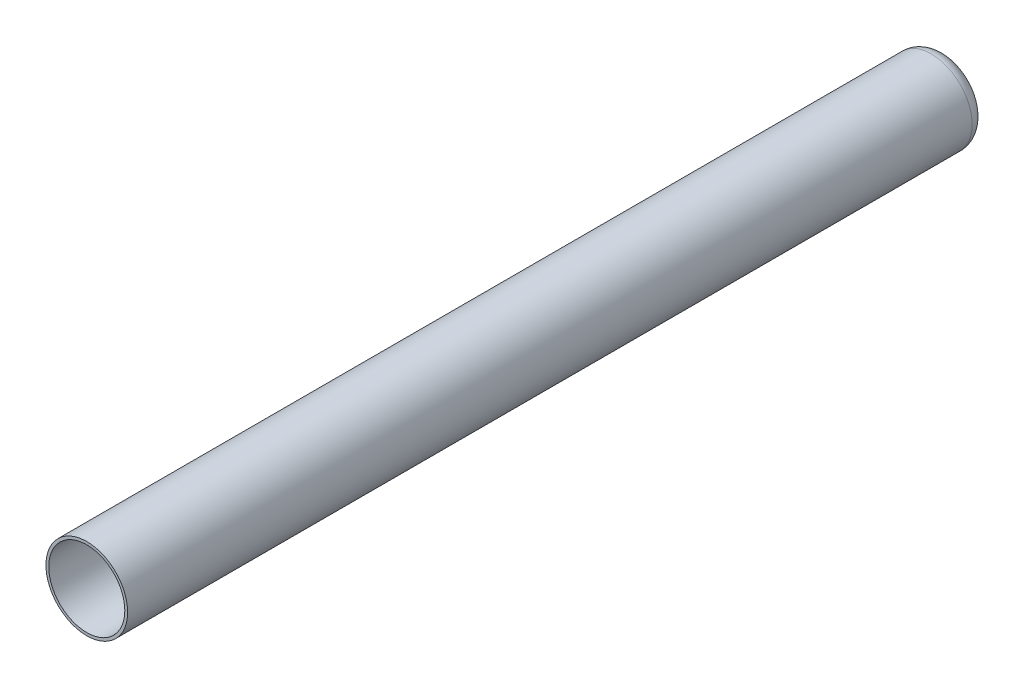
ISO-10303-21;
HEADER;
FILE_DESCRIPTION(('STEP AP214'),'2;1');
FILE_NAME('part.step','',(''),(''),'','','');
FILE_SCHEMA(('AUTOMOTIVE_DESIGN { 1 0 10303 214 1 1 1 1 }'));
ENDSEC;
DATA;
#1=APPLICATION_CONTEXT('core data for automotive mechanical design processes');
#2=APPLICATION_PROTOCOL_DEFINITION('international standard','automotive_design',2000,#1);
#3=PRODUCT_CONTEXT('',#1,'mechanical');
#4=PRODUCT('Part','Part','',(#3));
#5=PRODUCT_RELATED_PRODUCT_CATEGORY('part','',(#4));
#6=PRODUCT_DEFINITION_FORMATION('','',#4);
#7=PRODUCT_DEFINITION_CONTEXT('part definition',#1,'design');
#8=PRODUCT_DEFINITION('design','',#6,#7);
#9=PRODUCT_DEFINITION_SHAPE('','',#8);
#10=(LENGTH_UNIT() NAMED_UNIT(*) SI_UNIT(.MILLI.,.METRE.));
#11=(NAMED_UNIT(*) PLANE_ANGLE_UNIT() SI_UNIT($,.RADIAN.));
#12=(NAMED_UNIT(*) SI_UNIT($,.STERADIAN.) SOLID_ANGLE_UNIT());
#13=UNCERTAINTY_MEASURE_WITH_UNIT(LENGTH_MEASURE(1.E-05),#10,'distance_accuracy_value','');
#14=(GEOMETRIC_REPRESENTATION_CONTEXT(3) GLOBAL_UNCERTAINTY_ASSIGNED_CONTEXT((#13)) GLOBAL_UNIT_ASSIGNED_CONTEXT((#10,
#11,#12)) REPRESENTATION_CONTEXT('',''));
#15=CARTESIAN_POINT('',(0.,0.,0.));
#16=DIRECTION('',(0.,0.,1.));
#17=DIRECTION('',(1.,0.,0.));
#18=AXIS2_PLACEMENT_3D('',#15,#16,#17);
#19=CARTESIAN_POINT('',(0.,0.,-304.8));
#20=DIRECTION('',(0.,0.,1.));
#21=DIRECTION('',(1.,0.,0.));
#22=AXIS2_PLACEMENT_3D('',#19,#20,#21);
#23=CYLINDRICAL_SURFACE('',#22,14.5);
#24=CARTESIAN_POINT('',(0.,0.,-299.8));
#25=DIRECTION('',(0.,0.,1.));
#26=DIRECTION('',(1.,0.,0.));
#27=AXIS2_PLACEMENT_3D('',#24,#25,#26);
#28=CIRCLE('',#27,14.5);
#29=CARTESIAN_POINT('',(14.5,0.,-299.8));
#30=VERTEX_POINT('',#29);
#31=EDGE_CURVE('E11',#30,#30,#28,.T.);
#32=CARTESIAN_POINT('',(0.,0.,0.));
#33=DIRECTION('',(0.,0.,1.));
#34=DIRECTION('',(1.,0.,0.));
#35=AXIS2_PLACEMENT_3D('',#32,#33,#34);
#36=CIRCLE('',#35,14.5);
#37=CARTESIAN_POINT('',(14.5,0.,0.));
#38=VERTEX_POINT('',#37);
#39=EDGE_CURVE('E42',#38,#38,#36,.T.);
#40=CARTESIAN_POINT('',(14.5,0.,-299.8));
#41=CARTESIAN_POINT('',(14.5,0.,-296.677083333333));
#42=CARTESIAN_POINT('',(14.5,0.,-293.554166666667));
#43=CARTESIAN_POINT('',(14.5,0.,-287.308333333333));
#44=CARTESIAN_POINT('',(14.5,0.,-284.185416666667));
#45=CARTESIAN_POINT('',(14.5,0.,-277.939583333333));
#46=CARTESIAN_POINT('',(14.5,0.,-274.816666666667));
#47=CARTESIAN_POINT('',(14.5,0.,-268.570833333333));
#48=CARTESIAN_POINT('',(14.5,0.,-265.447916666667));
#49=CARTESIAN_POINT('',(14.5,0.,-259.202083333333));
#50=CARTESIAN_POINT('',(14.5,0.,-256.079166666667));
#51=CARTESIAN_POINT('',(14.5,0.,-249.833333333333));
#52=CARTESIAN_POINT('',(14.5,0.,-246.710416666667));
#53=CARTESIAN_POINT('',(14.5,0.,-240.464583333333));
#54=CARTESIAN_POINT('',(14.5,0.,-237.341666666667));
#55=CARTESIAN_POINT('',(14.5,0.,-231.095833333333));
#56=CARTESIAN_POINT('',(14.5,0.,-227.972916666667));
#57=CARTESIAN_POINT('',(14.5,0.,-221.727083333333));
#58=CARTESIAN_POINT('',(14.5,0.,-218.604166666667));
#59=CARTESIAN_POINT('',(14.5,0.,-212.358333333333));
#60=CARTESIAN_POINT('',(14.5,0.,-209.235416666667));
#61=CARTESIAN_POINT('',(14.5,0.,-202.989583333333));
#62=CARTESIAN_POINT('',(14.5,0.,-199.866666666667));
#63=CARTESIAN_POINT('',(14.5,0.,-193.620833333333));
#64=CARTESIAN_POINT('',(14.5,0.,-190.497916666667));
#65=CARTESIAN_POINT('',(14.5,0.,-184.252083333333));
#66=CARTESIAN_POINT('',(14.5,0.,-181.129166666667));
#67=CARTESIAN_POINT('',(14.5,0.,-174.883333333333));
#68=CARTESIAN_POINT('',(14.5,0.,-171.760416666667));
#69=CARTESIAN_POINT('',(14.5,0.,-165.514583333333));
#70=CARTESIAN_POINT('',(14.5,0.,-162.391666666667));
#71=CARTESIAN_POINT('',(14.5,0.,-156.145833333333));
#72=CARTESIAN_POINT('',(14.5,0.,-153.022916666667));
#73=CARTESIAN_POINT('',(14.5,0.,-146.777083333333));
#74=CARTESIAN_POINT('',(14.5,0.,-143.654166666667));
#75=CARTESIAN_POINT('',(14.5,0.,-137.408333333333));
#76=CARTESIAN_POINT('',(14.5,0.,-134.285416666667));
#77=CARTESIAN_POINT('',(14.5,0.,-128.039583333333));
#78=CARTESIAN_POINT('',(14.5,0.,-124.916666666667));
#79=CARTESIAN_POINT('',(14.5,0.,-118.670833333333));
#80=CARTESIAN_POINT('',(14.5,0.,-115.547916666667));
#81=CARTESIAN_POINT('',(14.5,0.,-109.302083333333));
#82=CARTESIAN_POINT('',(14.5,0.,-106.179166666667));
#83=CARTESIAN_POINT('',(14.5,0.,-99.9333333333334));
#84=CARTESIAN_POINT('',(14.5,0.,-96.8104166666667));
#85=CARTESIAN_POINT('',(14.5,0.,-90.5645833333334));
#86=CARTESIAN_POINT('',(14.5,0.,-87.4416666666667));
#87=CARTESIAN_POINT('',(14.5,0.,-81.1958333333334));
#88=CARTESIAN_POINT('',(14.5,0.,-78.0729166666667));
#89=CARTESIAN_POINT('',(14.5,0.,-71.8270833333333));
#90=CARTESIAN_POINT('',(14.5,0.,-68.7041666666667));
#91=CARTESIAN_POINT('',(14.5,0.,-62.4583333333333));
#92=CARTESIAN_POINT('',(14.5,0.,-59.3354166666667));
#93=CARTESIAN_POINT('',(14.5,0.,-53.0895833333333));
#94=CARTESIAN_POINT('',(14.5,0.,-49.9666666666667));
#95=CARTESIAN_POINT('',(14.5,0.,-43.7208333333334));
#96=CARTESIAN_POINT('',(14.5,0.,-40.5979166666667));
#97=CARTESIAN_POINT('',(14.5,0.,-34.3520833333334));
#98=CARTESIAN_POINT('',(14.5,0.,-31.2291666666667));
#99=CARTESIAN_POINT('',(14.5,0.,-24.9833333333333));
#100=CARTESIAN_POINT('',(14.5,0.,-21.8604166666667));
#101=CARTESIAN_POINT('',(14.5,0.,-15.6145833333333));
#102=CARTESIAN_POINT('',(14.5,0.,-12.4916666666667));
#103=CARTESIAN_POINT('',(14.5,0.,-6.24583333333332));
#104=CARTESIAN_POINT('',(14.5,0.,-3.12291666666666));
#105=CARTESIAN_POINT('',(14.5,0.,0.));
#106=B_SPLINE_CURVE_WITH_KNOTS('',3,(#40,#41,#42,#43,#44,#45,#46,#47,#48,#49,#50,#51,#52,#53,
#54,#55,#56,#57,#58,#59,#60,#61,#62,#63,#64,#65,#66,#67,#68,#69,#70,#71,#72,#73,#74,#75,#76,#77,
#78,#79,#80,#81,#82,#83,#84,#85,#86,#87,#88,#89,#90,#91,#92,#93,#94,#95,#96,#97,#98,#99,#100,
#101,#102,#103,#104,#105),.UNSPECIFIED.,.F.,.F.,(4,2,2,2,2,2,2,2,2,2,2,2,2,2,2,2,2,2,2,2,2,2,2,
2,2,2,2,2,2,2,2,2,4),(0.,9.36874999999998,18.7375,28.1062499999999,37.475,46.84375,56.2125,
65.58125,74.95,84.31875,93.6875,103.05625,112.425,121.79375,131.1625,140.53125,149.9,159.26875,
168.6375,178.00625,187.375,196.74375,206.1125,215.48125,224.85,234.21875,243.5875,252.95625,
262.325,271.69375,281.0625,290.43125,299.8),.UNSPECIFIED.);
#107=EDGE_CURVE('BSEAM35',#30,#38,#106,.T.);
#108=ORIENTED_EDGE('',*,*,#31,.T.);
#109=ORIENTED_EDGE('',*,*,#39,.F.);
#110=ORIENTED_EDGE('',*,*,#107,.T.);
#111=ORIENTED_EDGE('',*,*,#107,.F.);
#112=EDGE_LOOP('',(#108,#110,#109,#111));
#113=FACE_BOUND('',#112,.T.);
#114=ADVANCED_FACE('F35',(#113),#23,.T.);
#115=CARTESIAN_POINT('',(0.,0.,0.));
#116=DIRECTION('',(0.,0.,1.));
#117=DIRECTION('',(1.,0.,0.));
#118=AXIS2_PLACEMENT_3D('',#115,#116,#117);
#119=PLANE('',#118);
#120=CARTESIAN_POINT('',(0.,0.,0.));
#121=DIRECTION('',(0.,0.,1.));
#122=DIRECTION('',(1.,0.,0.));
#123=AXIS2_PLACEMENT_3D('',#120,#121,#122);
#124=CIRCLE('',#123,13.5);
#125=CARTESIAN_POINT('',(13.5,0.,0.));
#126=VERTEX_POINT('',#125);
#127=EDGE_CURVE('E50',#126,#126,#124,.T.);
#128=ORIENTED_EDGE('',*,*,#127,.F.);
#129=EDGE_LOOP('',(#128));
#130=FACE_BOUND('',#129,.T.);
#131=ORIENTED_EDGE('',*,*,#39,.T.);
#132=EDGE_LOOP('',(#131));
#133=FACE_BOUND('',#132,.T.);
#134=ADVANCED_FACE('F77',(#130,#133),#119,.T.);
#135=CARTESIAN_POINT('',(0.,0.,-640.183766184074));
#136=DIRECTION('',(0.,0.,1.));
#137=DIRECTION('',(1.,0.,0.));
#138=AXIS2_PLACEMENT_3D('',#135,#136,#137);
#139=CYLINDRICAL_SURFACE('',#138,13.5);
#140=CARTESIAN_POINT('',(0.,0.,-301.));
#141=DIRECTION('',(0.,0.,1.));
#142=DIRECTION('',(1.,0.,0.));
#143=AXIS2_PLACEMENT_3D('',#140,#141,#142);
#144=CIRCLE('',#143,13.5);
#145=CARTESIAN_POINT('',(13.5,0.,-301.));
#146=VERTEX_POINT('',#145);
#147=EDGE_CURVE('E46',#146,#146,#144,.F.);
#148=CARTESIAN_POINT('',(13.5,0.,-301.));
#149=CARTESIAN_POINT('',(13.5,0.,-297.864583333333));
#150=CARTESIAN_POINT('',(13.5,0.,-294.729166666667));
#151=CARTESIAN_POINT('',(13.5,0.,-288.458333333333));
#152=CARTESIAN_POINT('',(13.5,0.,-285.322916666667));
#153=CARTESIAN_POINT('',(13.5,0.,-279.052083333333));
#154=CARTESIAN_POINT('',(13.5,0.,-275.916666666667));
#155=CARTESIAN_POINT('',(13.5,0.,-269.645833333333));
#156=CARTESIAN_POINT('',(13.5,0.,-266.510416666667));
#157=CARTESIAN_POINT('',(13.5,0.,-260.239583333333));
#158=CARTESIAN_POINT('',(13.5,0.,-257.104166666667));
#159=CARTESIAN_POINT('',(13.5,0.,-250.833333333333));
#160=CARTESIAN_POINT('',(13.5,0.,-247.697916666667));
#161=CARTESIAN_POINT('',(13.5,0.,-241.427083333333));
#162=CARTESIAN_POINT('',(13.5,0.,-238.291666666667));
#163=CARTESIAN_POINT('',(13.5,0.,-232.020833333333));
#164=CARTESIAN_POINT('',(13.5,0.,-228.885416666667));
#165=CARTESIAN_POINT('',(13.5,0.,-222.614583333333));
#166=CARTESIAN_POINT('',(13.5,0.,-219.479166666667));
#167=CARTESIAN_POINT('',(13.5,0.,-213.208333333333));
#168=CARTESIAN_POINT('',(13.5,0.,-210.072916666667));
#169=CARTESIAN_POINT('',(13.5,0.,-203.802083333333));
#170=CARTESIAN_POINT('',(13.5,0.,-200.666666666667));
#171=CARTESIAN_POINT('',(13.5,0.,-194.395833333333));
#172=CARTESIAN_POINT('',(13.5,0.,-191.260416666667));
#173=CARTESIAN_POINT('',(13.5,0.,-184.989583333333));
#174=CARTESIAN_POINT('',(13.5,0.,-181.854166666667));
#175=CARTESIAN_POINT('',(13.5,0.,-175.583333333333));
#176=CARTESIAN_POINT('',(13.5,0.,-172.447916666667));
#177=CARTESIAN_POINT('',(13.5,0.,-166.177083333333));
#178=CARTESIAN_POINT('',(13.5,0.,-163.041666666667));
#179=CARTESIAN_POINT('',(13.5,0.,-156.770833333333));
#180=CARTESIAN_POINT('',(13.5,0.,-153.635416666667));
#181=CARTESIAN_POINT('',(13.5,0.,-147.364583333333));
#182=CARTESIAN_POINT('',(13.5,0.,-144.229166666667));
#183=CARTESIAN_POINT('',(13.5,0.,-137.958333333333));
#184=CARTESIAN_POINT('',(13.5,0.,-134.822916666667));
#185=CARTESIAN_POINT('',(13.5,0.,-128.552083333333));
#186=CARTESIAN_POINT('',(13.5,0.,-125.416666666667));
#187=CARTESIAN_POINT('',(13.5,0.,-119.145833333333));
#188=CARTESIAN_POINT('',(13.5,0.,-116.010416666667));
#189=CARTESIAN_POINT('',(13.5,0.,-109.739583333333));
#190=CARTESIAN_POINT('',(13.5,0.,-106.604166666667));
#191=CARTESIAN_POINT('',(13.5,0.,-100.333333333333));
#192=CARTESIAN_POINT('',(13.5,0.,-97.1979166666667));
#193=CARTESIAN_POINT('',(13.5,0.,-90.9270833333334));
#194=CARTESIAN_POINT('',(13.5,0.,-87.7916666666667));
#195=CARTESIAN_POINT('',(13.5,0.,-81.5208333333333));
#196=CARTESIAN_POINT('',(13.5,0.,-78.3854166666667));
#197=CARTESIAN_POINT('',(13.5,0.,-72.1145833333334));
#198=CARTESIAN_POINT('',(13.5,0.,-68.9791666666667));
#199=CARTESIAN_POINT('',(13.5,0.,-62.7083333333333));
#200=CARTESIAN_POINT('',(13.5,0.,-59.5729166666667));
#201=CARTESIAN_POINT('',(13.5,0.,-53.3020833333334));
#202=CARTESIAN_POINT('',(13.5,0.,-50.1666666666667));
#203=CARTESIAN_POINT('',(13.5,0.,-43.8958333333334));
#204=CARTESIAN_POINT('',(13.5,0.,-40.7604166666667));
#205=CARTESIAN_POINT('',(13.5,0.,-34.4895833333333));
#206=CARTESIAN_POINT('',(13.5,0.,-31.3541666666666));
#207=CARTESIAN_POINT('',(13.5,0.,-25.0833333333333));
#208=CARTESIAN_POINT('',(13.5,0.,-21.9479166666667));
#209=CARTESIAN_POINT('',(13.5,0.,-15.6770833333334));
#210=CARTESIAN_POINT('',(13.5,0.,-12.5416666666667));
#211=CARTESIAN_POINT('',(13.5,0.,-6.27083333333337));
#212=CARTESIAN_POINT('',(13.5,0.,-3.13541666666669));
#213=CARTESIAN_POINT('',(13.5,0.,0.));
#214=B_SPLINE_CURVE_WITH_KNOTS('',3,(#148,#149,#150,#151,#152,#153,#154,#155,#156,#157,#158,
#159,#160,#161,#162,#163,#164,#165,#166,#167,#168,#169,#170,#171,#172,#173,#174,#175,#176,#177,
#178,#179,#180,#181,#182,#183,#184,#185,#186,#187,#188,#189,#190,#191,#192,#193,#194,#195,#196,
#197,#198,#199,#200,#201,#202,#203,#204,#205,#206,#207,#208,#209,#210,#211,#212,#213),
.UNSPECIFIED.,.F.,.F.,(4,2,2,2,2,2,2,2,2,2,2,2,2,2,2,2,2,2,2,2,2,2,2,2,2,2,2,2,2,2,2,2,4),(0.,
9.40625000000001,18.8125,28.21875,37.625,47.03125,56.4375,65.84375,75.25,84.65625,94.0625,
103.46875,112.875,122.28125,131.6875,141.09375,150.5,159.90625,169.3125,178.71875,188.125,
197.53125,206.9375,216.34375,225.75,235.15625,244.5625,253.96875,263.375,272.78125,282.1875,
291.59375,301.),.UNSPECIFIED.);
#215=EDGE_CURVE('BSEAM73',#146,#126,#214,.T.);
#216=ORIENTED_EDGE('',*,*,#147,.T.);
#217=ORIENTED_EDGE('',*,*,#127,.T.);
#218=ORIENTED_EDGE('',*,*,#215,.T.);
#219=ORIENTED_EDGE('',*,*,#215,.F.);
#220=EDGE_LOOP('',(#216,#218,#217,#219));
#221=FACE_BOUND('',#220,.T.);
#222=ADVANCED_FACE('F73',(#221),#139,.F.);
#223=CARTESIAN_POINT('',(0.,0.,-301.));
#224=DIRECTION('',(0.,0.,1.));
#225=DIRECTION('',(1.,0.,0.));
#226=AXIS2_PLACEMENT_3D('',#223,#224,#225);
#227=PLANE('',#226);
#228=CARTESIAN_POINT('',(0.,0.,-301.));
#229=DIRECTION('',(0.,0.,1.));
#230=DIRECTION('',(1.,0.,0.));
#231=AXIS2_PLACEMENT_3D('',#228,#229,#230);
#232=CIRCLE('',#231,9.5);
#233=CARTESIAN_POINT('',(9.5,0.,-301.));
#234=VERTEX_POINT('',#233);
#235=EDGE_CURVE('E55',#234,#234,#232,.T.);
#236=ORIENTED_EDGE('',*,*,#235,.F.);
#237=EDGE_LOOP('',(#236));
#238=FACE_BOUND('',#237,.T.);
#239=ORIENTED_EDGE('',*,*,#147,.F.);
#240=EDGE_LOOP('',(#239));
#241=FACE_BOUND('',#240,.T.);
#242=ADVANCED_FACE('F66',(#238,#241),#227,.T.);
#243=CARTESIAN_POINT('',(0.,0.,-299.8));
#244=DIRECTION('',(0.,0.,1.));
#245=DIRECTION('',(1.,0.,0.));
#246=AXIS2_PLACEMENT_3D('',#243,#244,#245);
#247=TOROIDAL_SURFACE('',#246,9.5,5.);
#248=CARTESIAN_POINT('',(0.,0.,-304.8));
#249=DIRECTION('',(0.,0.,-1.));
#250=DIRECTION('',(-1.,0.,0.));
#251=AXIS2_PLACEMENT_3D('',#248,#249,#250);
#252=CIRCLE('',#251,9.5);
#253=CARTESIAN_POINT('',(-9.5,0.,-304.8));
#254=VERTEX_POINT('',#253);
#255=EDGE_CURVE('E58',#254,#254,#252,.T.);
#256=ORIENTED_EDGE('',*,*,#255,.F.);
#257=EDGE_LOOP('',(#256));
#258=FACE_BOUND('',#257,.T.);
#259=ORIENTED_EDGE('',*,*,#31,.F.);
#260=EDGE_LOOP('',(#259));
#261=FACE_BOUND('',#260,.T.);
#262=ADVANCED_FACE('F37',(#258,#261),#247,.T.);
#263=CARTESIAN_POINT('',(0.,0.,-294.8));
#264=DIRECTION('',(0.,0.,-1.));
#265=DIRECTION('',(-1.,0.,0.));
#266=AXIS2_PLACEMENT_3D('',#263,#264,#265);
#267=CYLINDRICAL_SURFACE('',#266,9.5);
#268=ORIENTED_EDGE('',*,*,#235,.T.);
#269=EDGE_LOOP('',(#268));
#270=FACE_BOUND('',#269,.T.);
#271=ORIENTED_EDGE('',*,*,#255,.T.);
#272=EDGE_LOOP('',(#271));
#273=FACE_BOUND('',#272,.T.);
#274=ADVANCED_FACE('F62',(#270,#273),#267,.F.);
#275=CLOSED_SHELL('',(#114,#134,#222,#242,#262,#274));
#276=MANIFOLD_SOLID_BREP('B2',#275);
#277=ADVANCED_BREP_SHAPE_REPRESENTATION('',(#18,#276),#14);
#278=SHAPE_DEFINITION_REPRESENTATION(#9,#277);
ENDSEC;
END-ISO-10303-21;
